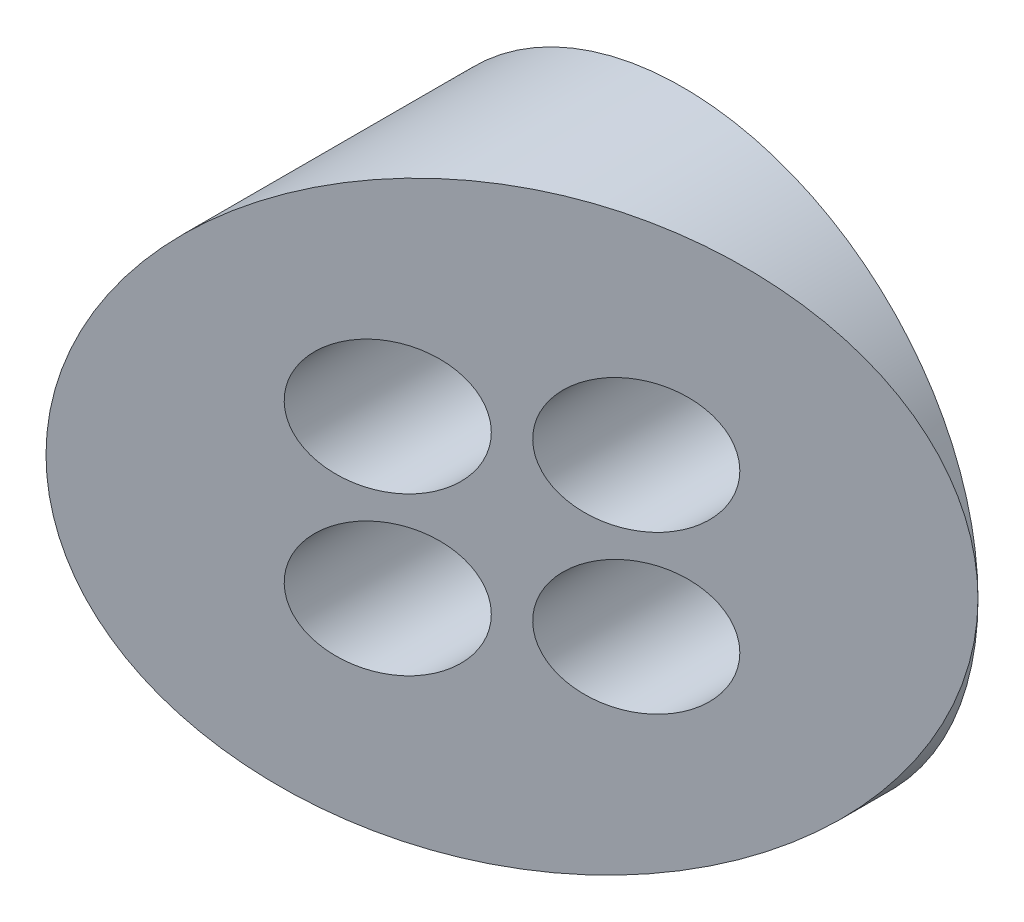
ISO-10303-21;
HEADER;
FILE_DESCRIPTION(('STEP AP214'),'2;1');
FILE_NAME('part.step','',(''),(''),'','','');
FILE_SCHEMA(('AUTOMOTIVE_DESIGN { 1 0 10303 214 1 1 1 1 }'));
ENDSEC;
DATA;
#1=APPLICATION_CONTEXT('core data for automotive mechanical design processes');
#2=APPLICATION_PROTOCOL_DEFINITION('international standard','automotive_design',2000,#1);
#3=PRODUCT_CONTEXT('',#1,'mechanical');
#4=PRODUCT('Part','Part','',(#3));
#5=PRODUCT_RELATED_PRODUCT_CATEGORY('part','',(#4));
#6=PRODUCT_DEFINITION_FORMATION('','',#4);
#7=PRODUCT_DEFINITION_CONTEXT('part definition',#1,'design');
#8=PRODUCT_DEFINITION('design','',#6,#7);
#9=PRODUCT_DEFINITION_SHAPE('','',#8);
#10=(LENGTH_UNIT() NAMED_UNIT(*) SI_UNIT(.MILLI.,.METRE.));
#11=(NAMED_UNIT(*) PLANE_ANGLE_UNIT() SI_UNIT($,.RADIAN.));
#12=(NAMED_UNIT(*) SI_UNIT($,.STERADIAN.) SOLID_ANGLE_UNIT());
#13=UNCERTAINTY_MEASURE_WITH_UNIT(LENGTH_MEASURE(1.E-05),#10,'distance_accuracy_value','');
#14=(GEOMETRIC_REPRESENTATION_CONTEXT(3) GLOBAL_UNCERTAINTY_ASSIGNED_CONTEXT((#13)) GLOBAL_UNIT_ASSIGNED_CONTEXT((#10,
#11,#12)) REPRESENTATION_CONTEXT('',''));
#15=CARTESIAN_POINT('',(0.,0.,0.));
#16=DIRECTION('',(0.,0.,1.));
#17=DIRECTION('',(1.,0.,0.));
#18=AXIS2_PLACEMENT_3D('',#15,#16,#17);
#19=CARTESIAN_POINT('',(0.,0.,5.2));
#20=DIRECTION('',(0.,0.,-1.));
#21=DIRECTION('',(-1.,0.,0.));
#22=AXIS2_PLACEMENT_3D('',#19,#20,#21);
#23=CYLINDRICAL_SURFACE('',#22,4.5);
#24=CARTESIAN_POINT('',(0.,0.,0.));
#25=DIRECTION('',(0.,0.,1.));
#26=DIRECTION('',(1.,0.,0.));
#27=AXIS2_PLACEMENT_3D('',#24,#25,#26);
#28=CIRCLE('',#27,4.5);
#29=CARTESIAN_POINT('',(4.5,0.,0.));
#30=VERTEX_POINT('',#29);
#31=EDGE_CURVE('E11',#30,#30,#28,.T.);
#32=ORIENTED_EDGE('',*,*,#31,.T.);
#33=CARTESIAN_POINT('',(0.,0.,2.6));
#34=DIRECTION('',(-0.500277597874629,0.,-0.865865073244551));
#35=DIRECTION('',(0.865865073244551,0.,-0.500277597874629));
#36=AXIS2_PLACEMENT_3D('',#33,#34,#35);
#37=ELLIPSE('',#36,5.19711458407451,4.5);
#38=EDGE_CURVE('E43',#30,#30,#37,.T.);
#39=ORIENTED_EDGE('',*,*,#38,.T.);
#40=EDGE_LOOP('',(#32,#39));
#41=FACE_BOUND('',#40,.T.);
#42=ADVANCED_FACE('F36',(#41),#23,.T.);
#43=CARTESIAN_POINT('',(0.,0.,0.));
#44=DIRECTION('',(0.,0.,1.));
#45=DIRECTION('',(1.,0.,0.));
#46=AXIS2_PLACEMENT_3D('',#43,#44,#45);
#47=PLANE('',#46);
#48=CARTESIAN_POINT('',(-1.2,-1.2,0.));
#49=DIRECTION('',(0.,0.,1.));
#50=DIRECTION('',(1.,0.,0.));
#51=AXIS2_PLACEMENT_3D('',#48,#49,#50);
#52=CIRCLE('',#51,1.);
#53=CARTESIAN_POINT('',(-0.199999999999999,-1.2,0.));
#54=VERTEX_POINT('',#53);
#55=EDGE_CURVE('E100',#54,#54,#52,.T.);
#56=ORIENTED_EDGE('',*,*,#55,.T.);
#57=EDGE_LOOP('',(#56));
#58=FACE_BOUND('',#57,.T.);
#59=CARTESIAN_POINT('',(1.2,-1.2,0.));
#60=DIRECTION('',(0.,0.,1.));
#61=DIRECTION('',(1.,0.,0.));
#62=AXIS2_PLACEMENT_3D('',#59,#60,#61);
#63=CIRCLE('',#62,1.);
#64=CARTESIAN_POINT('',(2.2,-1.2,0.));
#65=VERTEX_POINT('',#64);
#66=EDGE_CURVE('E104',#65,#65,#63,.T.);
#67=ORIENTED_EDGE('',*,*,#66,.T.);
#68=EDGE_LOOP('',(#67));
#69=FACE_BOUND('',#68,.T.);
#70=CARTESIAN_POINT('',(1.2,1.2,0.));
#71=DIRECTION('',(0.,0.,1.));
#72=DIRECTION('',(1.,0.,0.));
#73=AXIS2_PLACEMENT_3D('',#70,#71,#72);
#74=CIRCLE('',#73,1.);
#75=CARTESIAN_POINT('',(2.2,1.2,0.));
#76=VERTEX_POINT('',#75);
#77=EDGE_CURVE('E108',#76,#76,#74,.T.);
#78=ORIENTED_EDGE('',*,*,#77,.T.);
#79=EDGE_LOOP('',(#78));
#80=FACE_BOUND('',#79,.T.);
#81=CARTESIAN_POINT('',(-1.2,1.2,0.));
#82=DIRECTION('',(0.,0.,1.));
#83=DIRECTION('',(1.,0.,0.));
#84=AXIS2_PLACEMENT_3D('',#81,#82,#83);
#85=CIRCLE('',#84,1.);
#86=CARTESIAN_POINT('',(-0.2,1.2,0.));
#87=VERTEX_POINT('',#86);
#88=EDGE_CURVE('E54',#87,#87,#85,.T.);
#89=ORIENTED_EDGE('',*,*,#88,.T.);
#90=EDGE_LOOP('',(#89));
#91=FACE_BOUND('',#90,.T.);
#92=ORIENTED_EDGE('',*,*,#31,.F.);
#93=EDGE_LOOP('',(#92));
#94=FACE_BOUND('',#93,.T.);
#95=ADVANCED_FACE('F70',(#58,#69,#80,#91,#94),#47,.F.);
#96=CARTESIAN_POINT('',(-4.5,-4.5,5.2));
#97=DIRECTION('',(-0.500277597874629,0.,-0.865865073244551));
#98=DIRECTION('',(-0.865865073244551,0.,0.500277597874629));
#99=AXIS2_PLACEMENT_3D('',#96,#97,#98);
#100=PLANE('',#99);
#101=CARTESIAN_POINT('',(-1.2,-1.2,3.29333333333333));
#102=DIRECTION('',(-0.500277597874629,0.,-0.865865073244551));
#103=DIRECTION('',(0.865865073244551,0.,-0.500277597874629));
#104=AXIS2_PLACEMENT_3D('',#101,#102,#103);
#105=ELLIPSE('',#104,1.15491435201656,1.);
#106=CARTESIAN_POINT('',(-0.199999999999999,-1.2,2.71555555555556));
#107=VERTEX_POINT('',#106);
#108=EDGE_CURVE('E39',#107,#107,#105,.F.);
#109=ORIENTED_EDGE('',*,*,#108,.F.);
#110=EDGE_LOOP('',(#109));
#111=FACE_BOUND('',#110,.T.);
#112=CARTESIAN_POINT('',(1.2,-1.2,1.90666666666667));
#113=DIRECTION('',(-0.500277597874629,0.,-0.865865073244551));
#114=DIRECTION('',(0.865865073244551,0.,-0.500277597874629));
#115=AXIS2_PLACEMENT_3D('',#112,#113,#114);
#116=ELLIPSE('',#115,1.15491435201656,1.);
#117=CARTESIAN_POINT('',(2.2,-1.2,1.32888888888889));
#118=VERTEX_POINT('',#117);
#119=EDGE_CURVE('E52',#118,#118,#116,.F.);
#120=ORIENTED_EDGE('',*,*,#119,.F.);
#121=EDGE_LOOP('',(#120));
#122=FACE_BOUND('',#121,.T.);
#123=CARTESIAN_POINT('',(1.2,1.2,1.90666666666667));
#124=DIRECTION('',(-0.500277597874629,0.,-0.865865073244551));
#125=DIRECTION('',(0.865865073244551,0.,-0.500277597874629));
#126=AXIS2_PLACEMENT_3D('',#123,#124,#125);
#127=ELLIPSE('',#126,1.15491435201656,1.);
#128=CARTESIAN_POINT('',(2.2,1.2,1.32888888888889));
#129=VERTEX_POINT('',#128);
#130=EDGE_CURVE('E60',#129,#129,#127,.F.);
#131=ORIENTED_EDGE('',*,*,#130,.F.);
#132=EDGE_LOOP('',(#131));
#133=FACE_BOUND('',#132,.T.);
#134=CARTESIAN_POINT('',(-1.2,1.2,3.29333333333333));
#135=DIRECTION('',(-0.500277597874629,0.,-0.865865073244551));
#136=DIRECTION('',(0.865865073244551,0.,-0.500277597874629));
#137=AXIS2_PLACEMENT_3D('',#134,#135,#136);
#138=ELLIPSE('',#137,1.15491435201656,1.);
#139=CARTESIAN_POINT('',(-0.2,1.2,2.71555555555556));
#140=VERTEX_POINT('',#139);
#141=EDGE_CURVE('E57',#140,#140,#138,.F.);
#142=ORIENTED_EDGE('',*,*,#141,.F.);
#143=EDGE_LOOP('',(#142));
#144=FACE_BOUND('',#143,.T.);
#145=ORIENTED_EDGE('',*,*,#38,.F.);
#146=EDGE_LOOP('',(#145));
#147=FACE_BOUND('',#146,.T.);
#148=ADVANCED_FACE('F48',(#111,#122,#133,#144,#147),#100,.F.);
#149=CARTESIAN_POINT('',(-1.2,1.2,5.2));
#150=DIRECTION('',(0.,0.,-1.));
#151=DIRECTION('',(-1.,0.,0.));
#152=AXIS2_PLACEMENT_3D('',#149,#150,#151);
#153=CYLINDRICAL_SURFACE('',#152,1.);
#154=ORIENTED_EDGE('',*,*,#88,.F.);
#155=EDGE_LOOP('',(#154));
#156=FACE_BOUND('',#155,.T.);
#157=ORIENTED_EDGE('',*,*,#141,.T.);
#158=EDGE_LOOP('',(#157));
#159=FACE_BOUND('',#158,.T.);
#160=ADVANCED_FACE('F69',(#156,#159),#153,.F.);
#161=CARTESIAN_POINT('',(1.2,1.2,5.2));
#162=DIRECTION('',(0.,0.,-1.));
#163=DIRECTION('',(-1.,0.,0.));
#164=AXIS2_PLACEMENT_3D('',#161,#162,#163);
#165=CYLINDRICAL_SURFACE('',#164,1.);
#166=ORIENTED_EDGE('',*,*,#77,.F.);
#167=EDGE_LOOP('',(#166));
#168=FACE_BOUND('',#167,.T.);
#169=ORIENTED_EDGE('',*,*,#130,.T.);
#170=EDGE_LOOP('',(#169));
#171=FACE_BOUND('',#170,.T.);
#172=ADVANCED_FACE('F78',(#168,#171),#165,.F.);
#173=CARTESIAN_POINT('',(1.2,-1.2,5.2));
#174=DIRECTION('',(0.,0.,-1.));
#175=DIRECTION('',(-1.,0.,0.));
#176=AXIS2_PLACEMENT_3D('',#173,#174,#175);
#177=CYLINDRICAL_SURFACE('',#176,1.);
#178=ORIENTED_EDGE('',*,*,#66,.F.);
#179=EDGE_LOOP('',(#178));
#180=FACE_BOUND('',#179,.T.);
#181=ORIENTED_EDGE('',*,*,#119,.T.);
#182=EDGE_LOOP('',(#181));
#183=FACE_BOUND('',#182,.T.);
#184=ADVANCED_FACE('F65',(#180,#183),#177,.F.);
#185=CARTESIAN_POINT('',(-1.2,-1.2,5.2));
#186=DIRECTION('',(0.,0.,-1.));
#187=DIRECTION('',(-1.,0.,0.));
#188=AXIS2_PLACEMENT_3D('',#185,#186,#187);
#189=CYLINDRICAL_SURFACE('',#188,1.);
#190=ORIENTED_EDGE('',*,*,#55,.F.);
#191=EDGE_LOOP('',(#190));
#192=FACE_BOUND('',#191,.T.);
#193=ORIENTED_EDGE('',*,*,#108,.T.);
#194=EDGE_LOOP('',(#193));
#195=FACE_BOUND('',#194,.T.);
#196=ADVANCED_FACE('F115',(#192,#195),#189,.F.);
#197=CLOSED_SHELL('',(#42,#95,#148,#160,#172,#184,#196));
#198=MANIFOLD_SOLID_BREP('B2',#197);
#199=ADVANCED_BREP_SHAPE_REPRESENTATION('',(#18,#198),#14);
#200=SHAPE_DEFINITION_REPRESENTATION(#9,#199);
ENDSEC;
END-ISO-10303-21;
